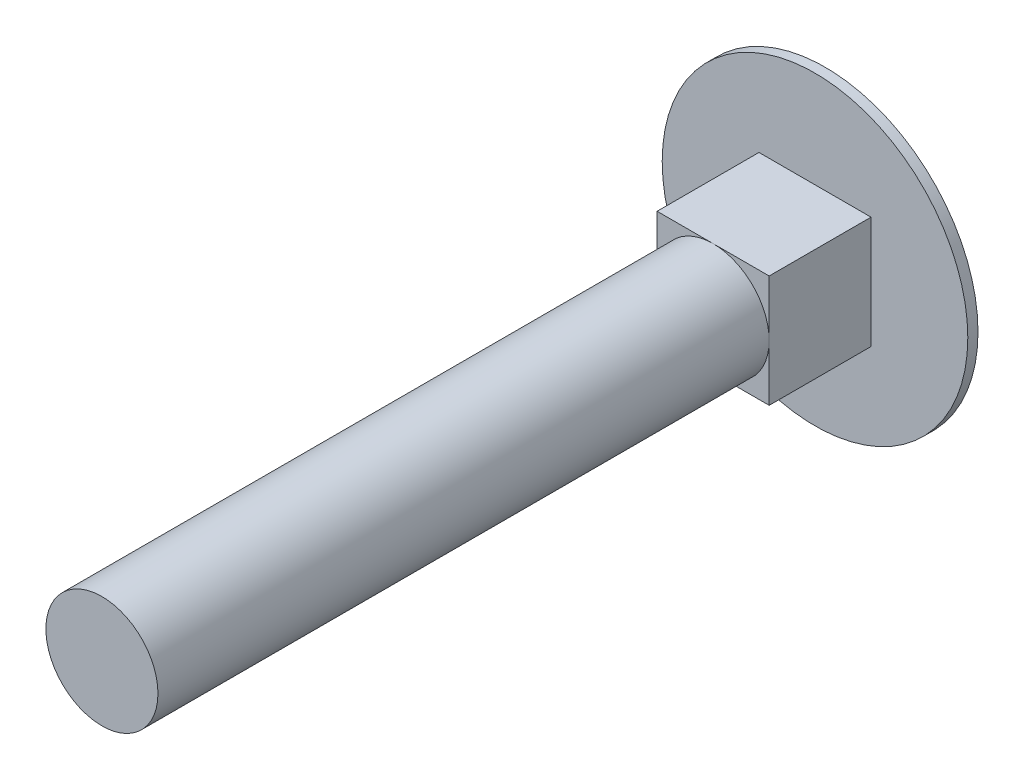
ISO-10303-21;
HEADER;
FILE_DESCRIPTION(('STEP AP214'),'2;1');
FILE_NAME('part.step','',(''),(''),'','','');
FILE_SCHEMA(('AUTOMOTIVE_DESIGN { 1 0 10303 214 1 1 1 1 }'));
ENDSEC;
DATA;
#1=APPLICATION_CONTEXT('core data for automotive mechanical design processes');
#2=APPLICATION_PROTOCOL_DEFINITION('international standard','automotive_design',2000,#1);
#3=PRODUCT_CONTEXT('',#1,'mechanical');
#4=PRODUCT('Part','Part','',(#3));
#5=PRODUCT_RELATED_PRODUCT_CATEGORY('part','',(#4));
#6=PRODUCT_DEFINITION_FORMATION('','',#4);
#7=PRODUCT_DEFINITION_CONTEXT('part definition',#1,'design');
#8=PRODUCT_DEFINITION('design','',#6,#7);
#9=PRODUCT_DEFINITION_SHAPE('','',#8);
#10=(LENGTH_UNIT() NAMED_UNIT(*) SI_UNIT(.MILLI.,.METRE.));
#11=(NAMED_UNIT(*) PLANE_ANGLE_UNIT() SI_UNIT($,.RADIAN.));
#12=(NAMED_UNIT(*) SI_UNIT($,.STERADIAN.) SOLID_ANGLE_UNIT());
#13=UNCERTAINTY_MEASURE_WITH_UNIT(LENGTH_MEASURE(1.E-05),#10,'distance_accuracy_value','');
#14=(GEOMETRIC_REPRESENTATION_CONTEXT(3) GLOBAL_UNCERTAINTY_ASSIGNED_CONTEXT((#13)) GLOBAL_UNIT_ASSIGNED_CONTEXT((#10,
#11,#12)) REPRESENTATION_CONTEXT('',''));
#15=CARTESIAN_POINT('',(0.,0.,0.));
#16=DIRECTION('',(0.,0.,1.));
#17=DIRECTION('',(1.,0.,0.));
#18=AXIS2_PLACEMENT_3D('',#15,#16,#17);
#19=CARTESIAN_POINT('',(0.,0.,30.));
#20=DIRECTION('',(0.,0.,-1.));
#21=DIRECTION('',(-1.,0.,0.));
#22=AXIS2_PLACEMENT_3D('',#19,#20,#21);
#23=CYLINDRICAL_SURFACE('',#22,2.75);
#24=CARTESIAN_POINT('',(0.,0.,30.));
#25=DIRECTION('',(0.,0.,1.));
#26=DIRECTION('',(1.,0.,0.));
#27=AXIS2_PLACEMENT_3D('',#24,#25,#26);
#28=CIRCLE('',#27,2.75);
#29=CARTESIAN_POINT('',(2.75,0.,30.));
#30=VERTEX_POINT('',#29);
#31=EDGE_CURVE('E11',#30,#30,#28,.T.);
#32=ORIENTED_EDGE('',*,*,#31,.F.);
#33=EDGE_LOOP('',(#32));
#34=FACE_BOUND('',#33,.T.);
#35=CARTESIAN_POINT('',(0.,0.,0.));
#36=DIRECTION('',(0.,0.,1.));
#37=DIRECTION('',(1.,0.,0.));
#38=AXIS2_PLACEMENT_3D('',#35,#36,#37);
#39=CIRCLE('',#38,2.75);
#40=CARTESIAN_POINT('',(2.75,0.,0.));
#41=VERTEX_POINT('',#40);
#42=CARTESIAN_POINT('',(0.,2.75,0.));
#43=VERTEX_POINT('',#42);
#44=EDGE_CURVE('E42',#41,#43,#39,.T.);
#45=ORIENTED_EDGE('',*,*,#44,.T.);
#46=CARTESIAN_POINT('',(-2.75,0.,0.));
#47=VERTEX_POINT('',#46);
#48=EDGE_CURVE('E138',#43,#47,#39,.T.);
#49=ORIENTED_EDGE('',*,*,#48,.T.);
#50=CARTESIAN_POINT('',(0.,-2.75,0.));
#51=VERTEX_POINT('',#50);
#52=EDGE_CURVE('E142',#47,#51,#39,.T.);
#53=ORIENTED_EDGE('',*,*,#52,.T.);
#54=EDGE_CURVE('E57',#51,#41,#39,.T.);
#55=ORIENTED_EDGE('',*,*,#54,.T.);
#56=EDGE_LOOP('',(#45,#49,#53,#55));
#57=FACE_BOUND('',#56,.T.);
#58=ADVANCED_FACE('F33',(#34,#57),#23,.T.);
#59=CARTESIAN_POINT('',(0.,0.,30.));
#60=DIRECTION('',(0.,0.,1.));
#61=DIRECTION('',(1.,0.,0.));
#62=AXIS2_PLACEMENT_3D('',#59,#60,#61);
#63=PLANE('',#62);
#64=ORIENTED_EDGE('',*,*,#31,.T.);
#65=EDGE_LOOP('',(#64));
#66=FACE_BOUND('',#65,.T.);
#67=ADVANCED_FACE('F169',(#66),#63,.T.);
#68=CARTESIAN_POINT('',(0.,0.,0.));
#69=DIRECTION('',(0.,0.,-1.));
#70=DIRECTION('',(-1.,0.,0.));
#71=AXIS2_PLACEMENT_3D('',#68,#69,#70);
#72=PLANE('',#71);
#73=ORIENTED_EDGE('',*,*,#44,.F.);
#74=DIRECTION('',(0.,-1.,0.));
#75=VECTOR('',#74,1.);
#76=CARTESIAN_POINT('',(2.75,2.75,0.));
#77=LINE('',#76,#75);
#78=CARTESIAN_POINT('',(2.75,2.75,0.));
#79=VERTEX_POINT('',#78);
#80=EDGE_CURVE('E50',#79,#41,#77,.T.);
#81=ORIENTED_EDGE('',*,*,#80,.F.);
#82=DIRECTION('',(1.,0.,0.));
#83=VECTOR('',#82,1.);
#84=CARTESIAN_POINT('',(-2.75,2.75,0.));
#85=LINE('',#84,#83);
#86=EDGE_CURVE('E127',#43,#79,#85,.T.);
#87=ORIENTED_EDGE('',*,*,#86,.F.);
#88=EDGE_LOOP('',(#73,#81,#87));
#89=FACE_BOUND('',#88,.T.);
#90=ADVANCED_FACE('F151',(#89),#72,.F.);
#91=ORIENTED_EDGE('',*,*,#48,.F.);
#92=CARTESIAN_POINT('',(-2.75,2.75,0.));
#93=VERTEX_POINT('',#92);
#94=EDGE_CURVE('E124',#93,#43,#85,.T.);
#95=ORIENTED_EDGE('',*,*,#94,.F.);
#96=DIRECTION('',(0.,-1.,0.));
#97=VECTOR('',#96,1.);
#98=CARTESIAN_POINT('',(-2.75,2.75,0.));
#99=LINE('',#98,#97);
#100=EDGE_CURVE('E106',#93,#47,#99,.T.);
#101=ORIENTED_EDGE('',*,*,#100,.T.);
#102=EDGE_LOOP('',(#91,#95,#101));
#103=FACE_BOUND('',#102,.T.);
#104=ADVANCED_FACE('F148',(#103),#72,.F.);
#105=ORIENTED_EDGE('',*,*,#52,.F.);
#106=CARTESIAN_POINT('',(-2.75,-2.75,0.));
#107=VERTEX_POINT('',#106);
#108=EDGE_CURVE('E118',#47,#107,#99,.T.);
#109=ORIENTED_EDGE('',*,*,#108,.T.);
#110=DIRECTION('',(1.,0.,0.));
#111=VECTOR('',#110,1.);
#112=CARTESIAN_POINT('',(-2.75,-2.75,0.));
#113=LINE('',#112,#111);
#114=EDGE_CURVE('E130',#107,#51,#113,.T.);
#115=ORIENTED_EDGE('',*,*,#114,.T.);
#116=EDGE_LOOP('',(#105,#109,#115));
#117=FACE_BOUND('',#116,.T.);
#118=ADVANCED_FACE('F145',(#117),#72,.F.);
#119=CARTESIAN_POINT('',(-2.75,2.75,-5.));
#120=DIRECTION('',(0.,-1.,0.));
#121=DIRECTION('',(1.,0.,0.));
#122=AXIS2_PLACEMENT_3D('',#119,#120,#121);
#123=PLANE('',#122);
#124=ORIENTED_EDGE('',*,*,#94,.T.);
#125=ORIENTED_EDGE('',*,*,#86,.T.);
#126=DIRECTION('',(0.,0.,1.));
#127=VECTOR('',#126,1.);
#128=CARTESIAN_POINT('',(2.75,2.75,-5.));
#129=LINE('',#128,#127);
#130=CARTESIAN_POINT('',(2.75,2.75,-5.));
#131=VERTEX_POINT('',#130);
#132=EDGE_CURVE('E114',#131,#79,#129,.T.);
#133=ORIENTED_EDGE('',*,*,#132,.F.);
#134=DIRECTION('',(1.,0.,0.));
#135=VECTOR('',#134,1.);
#136=CARTESIAN_POINT('',(-2.75,2.75,-5.));
#137=LINE('',#136,#135);
#138=CARTESIAN_POINT('',(-2.75,2.75,-5.));
#139=VERTEX_POINT('',#138);
#140=EDGE_CURVE('E93',#139,#131,#137,.T.);
#141=ORIENTED_EDGE('',*,*,#140,.F.);
#142=DIRECTION('',(0.,0.,1.));
#143=VECTOR('',#142,1.);
#144=CARTESIAN_POINT('',(-2.75,2.75,-5.));
#145=LINE('',#144,#143);
#146=EDGE_CURVE('E100',#139,#93,#145,.T.);
#147=ORIENTED_EDGE('',*,*,#146,.T.);
#148=EDGE_LOOP('',(#124,#125,#133,#141,#147));
#149=FACE_BOUND('',#148,.T.);
#150=ADVANCED_FACE('F113',(#149),#123,.F.);
#151=CARTESIAN_POINT('',(2.75,2.75,-5.));
#152=DIRECTION('',(-1.,0.,0.));
#153=DIRECTION('',(0.,-1.,0.));
#154=AXIS2_PLACEMENT_3D('',#151,#152,#153);
#155=PLANE('',#154);
#156=ORIENTED_EDGE('',*,*,#80,.T.);
#157=CARTESIAN_POINT('',(2.75,-2.75,0.));
#158=VERTEX_POINT('',#157);
#159=EDGE_CURVE('E126',#41,#158,#77,.T.);
#160=ORIENTED_EDGE('',*,*,#159,.T.);
#161=DIRECTION('',(0.,0.,1.));
#162=VECTOR('',#161,1.);
#163=CARTESIAN_POINT('',(2.75,-2.75,-5.));
#164=LINE('',#163,#162);
#165=CARTESIAN_POINT('',(2.75,-2.75,-5.));
#166=VERTEX_POINT('',#165);
#167=EDGE_CURVE('E134',#166,#158,#164,.T.);
#168=ORIENTED_EDGE('',*,*,#167,.F.);
#169=DIRECTION('',(0.,-1.,0.));
#170=VECTOR('',#169,1.);
#171=CARTESIAN_POINT('',(2.75,2.75,-5.));
#172=LINE('',#171,#170);
#173=EDGE_CURVE('E115',#131,#166,#172,.T.);
#174=ORIENTED_EDGE('',*,*,#173,.F.);
#175=ORIENTED_EDGE('',*,*,#132,.T.);
#176=EDGE_LOOP('',(#156,#160,#168,#174,#175));
#177=FACE_BOUND('',#176,.T.);
#178=ADVANCED_FACE('F152',(#177),#155,.F.);
#179=CARTESIAN_POINT('',(-2.75,-2.75,-5.));
#180=DIRECTION('',(0.,-1.,0.));
#181=DIRECTION('',(1.,0.,0.));
#182=AXIS2_PLACEMENT_3D('',#179,#180,#181);
#183=PLANE('',#182);
#184=ORIENTED_EDGE('',*,*,#114,.F.);
#185=DIRECTION('',(0.,0.,1.));
#186=VECTOR('',#185,1.);
#187=CARTESIAN_POINT('',(-2.75,-2.75,-5.));
#188=LINE('',#187,#186);
#189=CARTESIAN_POINT('',(-2.75,-2.75,-5.));
#190=VERTEX_POINT('',#189);
#191=EDGE_CURVE('E110',#190,#107,#188,.T.);
#192=ORIENTED_EDGE('',*,*,#191,.F.);
#193=DIRECTION('',(1.,0.,0.));
#194=VECTOR('',#193,1.);
#195=CARTESIAN_POINT('',(-2.75,-2.75,-5.));
#196=LINE('',#195,#194);
#197=EDGE_CURVE('E96',#190,#166,#196,.T.);
#198=ORIENTED_EDGE('',*,*,#197,.T.);
#199=ORIENTED_EDGE('',*,*,#167,.T.);
#200=EDGE_CURVE('E129',#51,#158,#113,.T.);
#201=ORIENTED_EDGE('',*,*,#200,.F.);
#202=EDGE_LOOP('',(#184,#192,#198,#199,#201));
#203=FACE_BOUND('',#202,.T.);
#204=ADVANCED_FACE('F155',(#203),#183,.T.);
#205=CARTESIAN_POINT('',(-2.75,2.75,-5.));
#206=DIRECTION('',(-1.,0.,0.));
#207=DIRECTION('',(0.,-1.,0.));
#208=AXIS2_PLACEMENT_3D('',#205,#206,#207);
#209=PLANE('',#208);
#210=ORIENTED_EDGE('',*,*,#100,.F.);
#211=ORIENTED_EDGE('',*,*,#146,.F.);
#212=DIRECTION('',(0.,-1.,0.));
#213=VECTOR('',#212,1.);
#214=CARTESIAN_POINT('',(-2.75,2.75,-5.));
#215=LINE('',#214,#213);
#216=EDGE_CURVE('E89',#139,#190,#215,.T.);
#217=ORIENTED_EDGE('',*,*,#216,.T.);
#218=ORIENTED_EDGE('',*,*,#191,.T.);
#219=ORIENTED_EDGE('',*,*,#108,.F.);
#220=EDGE_LOOP('',(#210,#211,#217,#218,#219));
#221=FACE_BOUND('',#220,.T.);
#222=ADVANCED_FACE('F103',(#221),#209,.T.);
#223=ORIENTED_EDGE('',*,*,#54,.F.);
#224=ORIENTED_EDGE('',*,*,#200,.T.);
#225=ORIENTED_EDGE('',*,*,#159,.F.);
#226=EDGE_LOOP('',(#223,#224,#225));
#227=FACE_BOUND('',#226,.T.);
#228=ADVANCED_FACE('F156',(#227),#72,.F.);
#229=CARTESIAN_POINT('',(0.,0.,-5.));
#230=DIRECTION('',(0.,0.,-1.));
#231=DIRECTION('',(-1.,0.,0.));
#232=AXIS2_PLACEMENT_3D('',#229,#230,#231);
#233=PLANE('',#232);
#234=CARTESIAN_POINT('',(0.,0.,-5.));
#235=DIRECTION('',(0.,0.,-1.));
#236=DIRECTION('',(-1.,0.,0.));
#237=AXIS2_PLACEMENT_3D('',#234,#235,#236);
#238=CIRCLE('',#237,7.5);
#239=CARTESIAN_POINT('',(-7.5,0.,-5.));
#240=VERTEX_POINT('',#239);
#241=EDGE_CURVE('E121',#240,#240,#238,.T.);
#242=ORIENTED_EDGE('',*,*,#241,.F.);
#243=EDGE_LOOP('',(#242));
#244=FACE_BOUND('',#243,.T.);
#245=ORIENTED_EDGE('',*,*,#216,.F.);
#246=ORIENTED_EDGE('',*,*,#140,.T.);
#247=ORIENTED_EDGE('',*,*,#173,.T.);
#248=ORIENTED_EDGE('',*,*,#197,.F.);
#249=EDGE_LOOP('',(#245,#246,#247,#248));
#250=FACE_BOUND('',#249,.T.);
#251=ADVANCED_FACE('F91',(#244,#250),#233,.F.);
#252=CARTESIAN_POINT('',(0.,0.,-5.5));
#253=DIRECTION('',(0.,0.,1.));
#254=DIRECTION('',(1.,0.,0.));
#255=AXIS2_PLACEMENT_3D('',#252,#253,#254);
#256=CYLINDRICAL_SURFACE('',#255,7.5);
#257=CARTESIAN_POINT('',(0.,0.,-5.5));
#258=DIRECTION('',(0.,0.,-1.));
#259=DIRECTION('',(-1.,0.,0.));
#260=AXIS2_PLACEMENT_3D('',#257,#258,#259);
#261=CIRCLE('',#260,7.5);
#262=CARTESIAN_POINT('',(-7.5,0.,-5.5));
#263=VERTEX_POINT('',#262);
#264=EDGE_CURVE('E37',#263,#263,#261,.T.);
#265=ORIENTED_EDGE('',*,*,#264,.F.);
#266=EDGE_LOOP('',(#265));
#267=FACE_BOUND('',#266,.T.);
#268=ORIENTED_EDGE('',*,*,#241,.T.);
#269=EDGE_LOOP('',(#268));
#270=FACE_BOUND('',#269,.T.);
#271=ADVANCED_FACE('F163',(#267,#270),#256,.T.);
#272=CARTESIAN_POINT('',(0.,0.,4.5));
#273=DIRECTION('',(0.,0.,1.));
#274=DIRECTION('',(1.,0.,0.));
#275=AXIS2_PLACEMENT_3D('',#272,#273,#274);
#276=SPHERICAL_SURFACE('',#275,12.5);
#277=ORIENTED_EDGE('',*,*,#264,.T.);
#278=EDGE_LOOP('',(#277));
#279=FACE_BOUND('',#278,.T.);
#280=ADVANCED_FACE('F35',(#279),#276,.T.);
#281=CLOSED_SHELL('',(#58,#67,#90,#104,#118,#150,#178,#204,#222,#228,#251,#271,#280));
#282=MANIFOLD_SOLID_BREP('B2',#281);
#283=ADVANCED_BREP_SHAPE_REPRESENTATION('',(#18,#282),#14);
#284=SHAPE_DEFINITION_REPRESENTATION(#9,#283);
ENDSEC;
END-ISO-10303-21;
